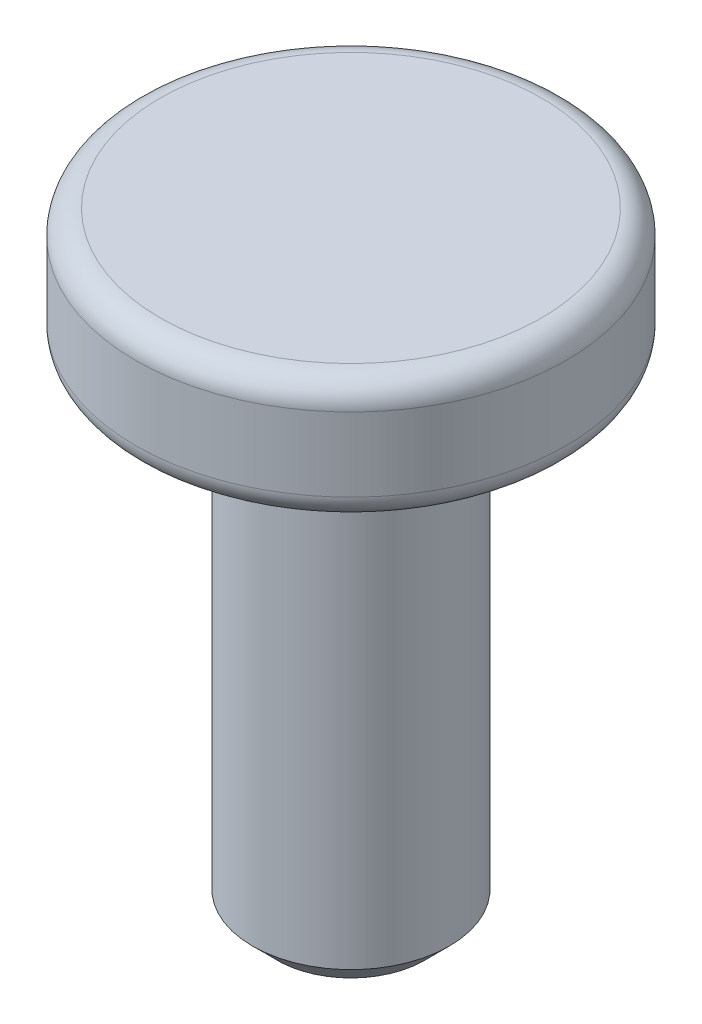
ISO-10303-21;
HEADER;
FILE_DESCRIPTION(('STEP AP214'),'2;1');
FILE_NAME('part.step','',(''),(''),'','','');
FILE_SCHEMA(('AUTOMOTIVE_DESIGN { 1 0 10303 214 1 1 1 1 }'));
ENDSEC;
DATA;
#1=APPLICATION_CONTEXT('core data for automotive mechanical design processes');
#2=APPLICATION_PROTOCOL_DEFINITION('international standard','automotive_design',2000,#1);
#3=PRODUCT_CONTEXT('',#1,'mechanical');
#4=PRODUCT('Part','Part','',(#3));
#5=PRODUCT_RELATED_PRODUCT_CATEGORY('part','',(#4));
#6=PRODUCT_DEFINITION_FORMATION('','',#4);
#7=PRODUCT_DEFINITION_CONTEXT('part definition',#1,'design');
#8=PRODUCT_DEFINITION('design','',#6,#7);
#9=PRODUCT_DEFINITION_SHAPE('','',#8);
#10=(LENGTH_UNIT() NAMED_UNIT(*) SI_UNIT(.MILLI.,.METRE.));
#11=(NAMED_UNIT(*) PLANE_ANGLE_UNIT() SI_UNIT($,.RADIAN.));
#12=(NAMED_UNIT(*) SI_UNIT($,.STERADIAN.) SOLID_ANGLE_UNIT());
#13=UNCERTAINTY_MEASURE_WITH_UNIT(LENGTH_MEASURE(1.E-05),#10,'distance_accuracy_value','');
#14=(GEOMETRIC_REPRESENTATION_CONTEXT(3) GLOBAL_UNCERTAINTY_ASSIGNED_CONTEXT((#13)) GLOBAL_UNIT_ASSIGNED_CONTEXT((#10,
#11,#12)) REPRESENTATION_CONTEXT('',''));
#15=CARTESIAN_POINT('',(0.,0.,0.));
#16=DIRECTION('',(0.,0.,1.));
#17=DIRECTION('',(1.,0.,0.));
#18=AXIS2_PLACEMENT_3D('',#15,#16,#17);
#19=CARTESIAN_POINT('',(0.,0.,0.));
#20=DIRECTION('',(0.,1.,0.));
#21=DIRECTION('',(0.,0.,1.));
#22=AXIS2_PLACEMENT_3D('',#19,#20,#21);
#23=PLANE('',#22);
#24=CARTESIAN_POINT('',(0.,0.,0.));
#25=DIRECTION('',(0.,1.,0.));
#26=DIRECTION('',(0.,0.,1.));
#27=AXIS2_PLACEMENT_3D('',#24,#25,#26);
#28=CIRCLE('',#27,1.55);
#29=CARTESIAN_POINT('',(0.,0.,1.55));
#30=VERTEX_POINT('',#29);
#31=EDGE_CURVE('E34',#30,#30,#28,.F.);
#32=ORIENTED_EDGE('',*,*,#31,.T.);
#33=EDGE_LOOP('',(#32));
#34=FACE_BOUND('',#33,.T.);
#35=CARTESIAN_POINT('',(0.,0.,0.));
#36=DIRECTION('',(0.,1.,0.));
#37=DIRECTION('',(0.,0.,1.));
#38=AXIS2_PLACEMENT_3D('',#35,#36,#37);
#39=CIRCLE('',#38,0.8);
#40=CARTESIAN_POINT('',(0.,0.,0.8));
#41=VERTEX_POINT('',#40);
#42=EDGE_CURVE('E25',#41,#41,#39,.F.);
#43=ORIENTED_EDGE('',*,*,#42,.F.);
#44=EDGE_LOOP('',(#43));
#45=FACE_BOUND('',#44,.T.);
#46=ADVANCED_FACE('F14',(#34,#45),#23,.F.);
#47=CARTESIAN_POINT('',(0.,1.,0.));
#48=DIRECTION('',(0.,-1.,0.));
#49=DIRECTION('',(0.,0.,-1.));
#50=AXIS2_PLACEMENT_3D('',#47,#48,#49);
#51=CYLINDRICAL_SURFACE('',#50,1.75);
#52=CARTESIAN_POINT('',(0.,0.2,0.));
#53=DIRECTION('',(0.,1.,0.));
#54=DIRECTION('',(0.,0.,1.));
#55=AXIS2_PLACEMENT_3D('',#52,#53,#54);
#56=CIRCLE('',#55,1.75);
#57=CARTESIAN_POINT('',(0.,0.2,1.75));
#58=VERTEX_POINT('',#57);
#59=EDGE_CURVE('E37',#58,#58,#56,.T.);
#60=ORIENTED_EDGE('',*,*,#59,.T.);
#61=EDGE_LOOP('',(#60));
#62=FACE_BOUND('',#61,.T.);
#63=CARTESIAN_POINT('',(0.,0.8,0.));
#64=DIRECTION('',(0.,1.,0.));
#65=DIRECTION('',(0.,0.,1.));
#66=AXIS2_PLACEMENT_3D('',#63,#64,#65);
#67=CIRCLE('',#66,1.75);
#68=CARTESIAN_POINT('',(0.,0.8,1.75));
#69=VERTEX_POINT('',#68);
#70=EDGE_CURVE('E40',#69,#69,#67,.F.);
#71=ORIENTED_EDGE('',*,*,#70,.T.);
#72=EDGE_LOOP('',(#71));
#73=FACE_BOUND('',#72,.T.);
#74=ADVANCED_FACE('F44',(#62,#73),#51,.T.);
#75=CARTESIAN_POINT('',(0.,1.,0.));
#76=DIRECTION('',(0.,1.,0.));
#77=DIRECTION('',(0.,0.,1.));
#78=AXIS2_PLACEMENT_3D('',#75,#76,#77);
#79=PLANE('',#78);
#80=CARTESIAN_POINT('',(0.,1.,0.));
#81=DIRECTION('',(0.,1.,0.));
#82=DIRECTION('',(0.,0.,1.));
#83=AXIS2_PLACEMENT_3D('',#80,#81,#82);
#84=CIRCLE('',#83,1.55);
#85=CARTESIAN_POINT('',(0.,1.,1.55));
#86=VERTEX_POINT('',#85);
#87=EDGE_CURVE('E29',#86,#86,#84,.T.);
#88=ORIENTED_EDGE('',*,*,#87,.T.);
#89=EDGE_LOOP('',(#88));
#90=FACE_BOUND('',#89,.T.);
#91=ADVANCED_FACE('F53',(#90),#79,.T.);
#92=CARTESIAN_POINT('',(0.,0.2,0.));
#93=DIRECTION('',(0.,1.,0.));
#94=DIRECTION('',(0.,0.,1.));
#95=AXIS2_PLACEMENT_3D('',#92,#93,#94);
#96=TOROIDAL_SURFACE('',#95,1.55,0.2);
#97=ORIENTED_EDGE('',*,*,#31,.F.);
#98=EDGE_LOOP('',(#97));
#99=FACE_BOUND('',#98,.T.);
#100=ORIENTED_EDGE('',*,*,#59,.F.);
#101=EDGE_LOOP('',(#100));
#102=FACE_BOUND('',#101,.T.);
#103=ADVANCED_FACE('F50',(#99,#102),#96,.T.);
#104=CARTESIAN_POINT('',(0.,0.8,0.));
#105=DIRECTION('',(0.,1.,0.));
#106=DIRECTION('',(0.,0.,1.));
#107=AXIS2_PLACEMENT_3D('',#104,#105,#106);
#108=TOROIDAL_SURFACE('',#107,1.55,0.2);
#109=ORIENTED_EDGE('',*,*,#70,.F.);
#110=EDGE_LOOP('',(#109));
#111=FACE_BOUND('',#110,.T.);
#112=ORIENTED_EDGE('',*,*,#87,.F.);
#113=EDGE_LOOP('',(#112));
#114=FACE_BOUND('',#113,.T.);
#115=ADVANCED_FACE('F46',(#111,#114),#108,.T.);
#116=CARTESIAN_POINT('',(0.,-4.,0.));
#117=DIRECTION('',(0.,1.,0.));
#118=DIRECTION('',(0.,0.,1.));
#119=AXIS2_PLACEMENT_3D('',#116,#117,#118);
#120=CYLINDRICAL_SURFACE('',#119,0.8);
#121=CARTESIAN_POINT('',(0.,-3.8,0.));
#122=DIRECTION('',(0.,-1.,0.));
#123=DIRECTION('',(0.,0.,-1.));
#124=AXIS2_PLACEMENT_3D('',#121,#122,#123);
#125=CIRCLE('',#124,0.8);
#126=CARTESIAN_POINT('',(0.,-3.8,-0.8));
#127=VERTEX_POINT('',#126);
#128=EDGE_CURVE('E10',#127,#127,#125,.F.);
#129=ORIENTED_EDGE('',*,*,#128,.T.);
#130=EDGE_LOOP('',(#129));
#131=FACE_BOUND('',#130,.T.);
#132=ORIENTED_EDGE('',*,*,#42,.T.);
#133=EDGE_LOOP('',(#132));
#134=FACE_BOUND('',#133,.T.);
#135=ADVANCED_FACE('F49',(#131,#134),#120,.T.);
#136=CARTESIAN_POINT('',(0.,-4.,0.));
#137=DIRECTION('',(0.,-1.,0.));
#138=DIRECTION('',(0.,0.,-1.));
#139=AXIS2_PLACEMENT_3D('',#136,#137,#138);
#140=PLANE('',#139);
#141=CARTESIAN_POINT('',(0.,-4.,0.));
#142=DIRECTION('',(0.,-1.,0.));
#143=DIRECTION('',(0.,0.,-1.));
#144=AXIS2_PLACEMENT_3D('',#141,#142,#143);
#145=CIRCLE('',#144,0.6);
#146=CARTESIAN_POINT('',(0.,-4.,-0.6));
#147=VERTEX_POINT('',#146);
#148=EDGE_CURVE('E21',#147,#147,#145,.T.);
#149=ORIENTED_EDGE('',*,*,#148,.T.);
#150=EDGE_LOOP('',(#149));
#151=FACE_BOUND('',#150,.T.);
#152=ADVANCED_FACE('F78',(#151),#140,.T.);
#153=CARTESIAN_POINT('',(0.,-4.,0.));
#154=DIRECTION('',(0.,1.,0.));
#155=DIRECTION('',(0.,0.,1.));
#156=AXIS2_PLACEMENT_3D('',#153,#154,#155);
#157=CONICAL_SURFACE('',#156,0.6,0.785398163397446);
#158=ORIENTED_EDGE('',*,*,#128,.F.);
#159=EDGE_LOOP('',(#158));
#160=FACE_BOUND('',#159,.T.);
#161=ORIENTED_EDGE('',*,*,#148,.F.);
#162=EDGE_LOOP('',(#161));
#163=FACE_BOUND('',#162,.T.);
#164=ADVANCED_FACE('F16',(#160,#163),#157,.T.);
#165=CLOSED_SHELL('',(#46,#74,#91,#103,#115,#135,#152,#164));
#166=MANIFOLD_SOLID_BREP('B1',#165);
#167=ADVANCED_BREP_SHAPE_REPRESENTATION('',(#18,#166),#14);
#168=SHAPE_DEFINITION_REPRESENTATION(#9,#167);
ENDSEC;
END-ISO-10303-21;
